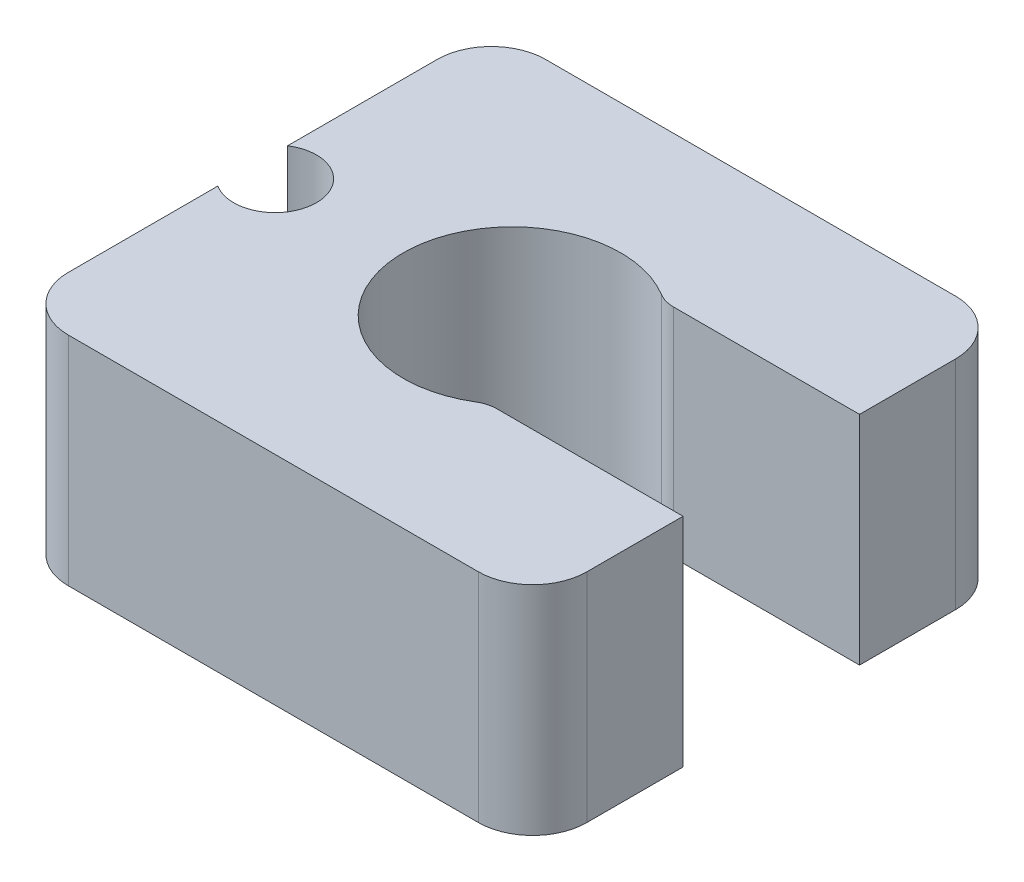
ISO-10303-21;
HEADER;
FILE_DESCRIPTION(('STEP AP214'),'2;1');
FILE_NAME('part.step','',(''),(''),'','','');
FILE_SCHEMA(('AUTOMOTIVE_DESIGN { 1 0 10303 214 1 1 1 1 }'));
ENDSEC;
DATA;
#1=APPLICATION_CONTEXT('core data for automotive mechanical design processes');
#2=APPLICATION_PROTOCOL_DEFINITION('international standard','automotive_design',2000,#1);
#3=PRODUCT_CONTEXT('',#1,'mechanical');
#4=PRODUCT('Part','Part','',(#3));
#5=PRODUCT_RELATED_PRODUCT_CATEGORY('part','',(#4));
#6=PRODUCT_DEFINITION_FORMATION('','',#4);
#7=PRODUCT_DEFINITION_CONTEXT('part definition',#1,'design');
#8=PRODUCT_DEFINITION('design','',#6,#7);
#9=PRODUCT_DEFINITION_SHAPE('','',#8);
#10=(LENGTH_UNIT() NAMED_UNIT(*) SI_UNIT(.MILLI.,.METRE.));
#11=(NAMED_UNIT(*) PLANE_ANGLE_UNIT() SI_UNIT($,.RADIAN.));
#12=(NAMED_UNIT(*) SI_UNIT($,.STERADIAN.) SOLID_ANGLE_UNIT());
#13=UNCERTAINTY_MEASURE_WITH_UNIT(LENGTH_MEASURE(1.E-05),#10,'distance_accuracy_value','');
#14=(GEOMETRIC_REPRESENTATION_CONTEXT(3) GLOBAL_UNCERTAINTY_ASSIGNED_CONTEXT((#13)) GLOBAL_UNIT_ASSIGNED_CONTEXT((#10,
#11,#12)) REPRESENTATION_CONTEXT('',''));
#15=CARTESIAN_POINT('',(0.,0.,0.));
#16=DIRECTION('',(0.,0.,1.));
#17=DIRECTION('',(1.,0.,0.));
#18=AXIS2_PLACEMENT_3D('',#15,#16,#17);
#19=CARTESIAN_POINT('',(2.38772044704865,2.,0.));
#20=DIRECTION('',(1.,0.,0.));
#21=DIRECTION('',(0.,0.,-1.));
#22=AXIS2_PLACEMENT_3D('',#19,#20,#21);
#23=PLANE('',#22);
#24=DIRECTION('',(0.,1.,0.));
#25=VECTOR('',#24,1.);
#26=CARTESIAN_POINT('',(2.38772044704865,0.,-0.81271182190646));
#27=LINE('',#26,#25);
#28=CARTESIAN_POINT('',(2.38772044704865,0.,-0.81271182190646));
#29=VERTEX_POINT('',#28);
#30=CARTESIAN_POINT('',(2.38772044704865,2.,-0.81271182190646));
#31=VERTEX_POINT('',#30);
#32=EDGE_CURVE('E165',#29,#31,#27,.T.);
#33=ORIENTED_EDGE('',*,*,#32,.F.);
#34=DIRECTION('',(0.,0.,1.));
#35=VECTOR('',#34,1.);
#36=CARTESIAN_POINT('',(2.38772044704865,0.,0.));
#37=LINE('',#36,#35);
#38=CARTESIAN_POINT('',(2.38772044704865,0.,-1.69775483675836));
#39=VERTEX_POINT('',#38);
#40=EDGE_CURVE('E178',#39,#29,#37,.T.);
#41=ORIENTED_EDGE('',*,*,#40,.F.);
#42=DIRECTION('',(0.,-1.,0.));
#43=VECTOR('',#42,1.);
#44=CARTESIAN_POINT('',(2.38772044704865,2.,-1.69775483675836));
#45=LINE('',#44,#43);
#46=CARTESIAN_POINT('',(2.38772044704865,2.,-1.69775483675836));
#47=VERTEX_POINT('',#46);
#48=EDGE_CURVE('E219',#39,#47,#45,.F.);
#49=ORIENTED_EDGE('',*,*,#48,.T.);
#50=DIRECTION('',(0.,0.,1.));
#51=VECTOR('',#50,1.);
#52=CARTESIAN_POINT('',(2.38772044704865,2.,0.));
#53=LINE('',#52,#51);
#54=EDGE_CURVE('E181',#47,#31,#53,.T.);
#55=ORIENTED_EDGE('',*,*,#54,.T.);
#56=EDGE_LOOP('',(#33,#41,#49,#55));
#57=FACE_BOUND('',#56,.T.);
#58=ADVANCED_FACE('F47',(#57),#23,.T.);
#59=DIRECTION('',(0.,1.,0.));
#60=VECTOR('',#59,1.);
#61=CARTESIAN_POINT('',(2.38772044704865,0.,0.812711821906446));
#62=LINE('',#61,#60);
#63=CARTESIAN_POINT('',(2.38772044704865,0.,0.812711821906446));
#64=VERTEX_POINT('',#63);
#65=CARTESIAN_POINT('',(2.38772044704865,2.,0.812711821906446));
#66=VERTEX_POINT('',#65);
#67=EDGE_CURVE('E172',#64,#66,#62,.T.);
#68=ORIENTED_EDGE('',*,*,#67,.T.);
#69=CARTESIAN_POINT('',(2.38772044704865,2.,1.69775483675836));
#70=VERTEX_POINT('',#69);
#71=EDGE_CURVE('E320',#66,#70,#53,.T.);
#72=ORIENTED_EDGE('',*,*,#71,.T.);
#73=DIRECTION('',(0.,-1.,0.));
#74=VECTOR('',#73,1.);
#75=CARTESIAN_POINT('',(2.38772044704865,0.,1.69775483675836));
#76=LINE('',#75,#74);
#77=CARTESIAN_POINT('',(2.38772044704865,0.,1.69775483675836));
#78=VERTEX_POINT('',#77);
#79=EDGE_CURVE('E262',#70,#78,#76,.T.);
#80=ORIENTED_EDGE('',*,*,#79,.T.);
#81=EDGE_CURVE('E190',#64,#78,#37,.T.);
#82=ORIENTED_EDGE('',*,*,#81,.F.);
#83=EDGE_LOOP('',(#68,#72,#80,#82));
#84=FACE_BOUND('',#83,.T.);
#85=ADVANCED_FACE('F365',(#84),#23,.T.);
#86=CARTESIAN_POINT('',(0.,2.,0.));
#87=DIRECTION('',(0.,-1.,0.));
#88=DIRECTION('',(0.,0.,-1.));
#89=AXIS2_PLACEMENT_3D('',#86,#87,#88);
#90=CYLINDRICAL_SURFACE('',#89,1.00190226245612);
#91=CARTESIAN_POINT('',(0.,0.,0.));
#92=DIRECTION('',(0.,1.,0.));
#93=DIRECTION('',(0.,0.,1.));
#94=AXIS2_PLACEMENT_3D('',#91,#92,#93);
#95=CIRCLE('',#94,1.00190226245612);
#96=CARTESIAN_POINT('',(0.520140217106621,0.,-0.856307361910992));
#97=VERTEX_POINT('',#96);
#98=CARTESIAN_POINT('',(0.520140217106639,0.,0.856307361910981));
#99=VERTEX_POINT('',#98);
#100=EDGE_CURVE('E200',#97,#99,#95,.T.);
#101=ORIENTED_EDGE('',*,*,#100,.F.);
#102=DIRECTION('',(0.,-1.,0.));
#103=VECTOR('',#102,1.);
#104=CARTESIAN_POINT('',(0.520140217106621,2.,-0.856307361910992));
#105=LINE('',#104,#103);
#106=CARTESIAN_POINT('',(0.520140217106621,2.,-0.856307361910992));
#107=VERTEX_POINT('',#106);
#108=EDGE_CURVE('E277',#97,#107,#105,.F.);
#109=ORIENTED_EDGE('',*,*,#108,.T.);
#110=CARTESIAN_POINT('',(0.,2.,0.));
#111=DIRECTION('',(0.,1.,0.));
#112=DIRECTION('',(0.,0.,1.));
#113=AXIS2_PLACEMENT_3D('',#110,#111,#112);
#114=CIRCLE('',#113,1.00190226245612);
#115=CARTESIAN_POINT('',(0.520140217106639,2.,0.856307361910981));
#116=VERTEX_POINT('',#115);
#117=EDGE_CURVE('E210',#107,#116,#114,.T.);
#118=ORIENTED_EDGE('',*,*,#117,.T.);
#119=DIRECTION('',(0.,-1.,0.));
#120=VECTOR('',#119,1.);
#121=CARTESIAN_POINT('',(0.520140217106639,2.,0.856307361910982));
#122=LINE('',#121,#120);
#123=EDGE_CURVE('E274',#116,#99,#122,.T.);
#124=ORIENTED_EDGE('',*,*,#123,.T.);
#125=EDGE_LOOP('',(#101,#109,#118,#124));
#126=FACE_BOUND('',#125,.T.);
#127=ADVANCED_FACE('F294',(#126),#90,.F.);
#128=CARTESIAN_POINT('',(0.,2.,0.));
#129=DIRECTION('',(0.,1.,0.));
#130=DIRECTION('',(0.,0.,1.));
#131=AXIS2_PLACEMENT_3D('',#128,#129,#130);
#132=PLANE('',#131);
#133=ORIENTED_EDGE('',*,*,#117,.F.);
#134=CARTESIAN_POINT('',(0.67588601285865,2.,-1.11271182190646));
#135=DIRECTION('',(0.,1.,0.));
#136=DIRECTION('',(0.,0.,1.));
#137=AXIS2_PLACEMENT_3D('',#134,#135,#136);
#138=CIRCLE('',#137,0.3);
#139=CARTESIAN_POINT('',(0.67588601285865,2.,-0.81271182190646));
#140=VERTEX_POINT('',#139);
#141=EDGE_CURVE('E56',#107,#140,#138,.T.);
#142=ORIENTED_EDGE('',*,*,#141,.T.);
#143=DIRECTION('',(-1.,0.,0.));
#144=VECTOR('',#143,1.);
#145=CARTESIAN_POINT('',(0.,2.,-0.81271182190646));
#146=LINE('',#145,#144);
#147=EDGE_CURVE('E284',#31,#140,#146,.T.);
#148=ORIENTED_EDGE('',*,*,#147,.F.);
#149=ORIENTED_EDGE('',*,*,#54,.F.);
#150=CARTESIAN_POINT('',(1.88772044704865,2.,-1.69775483675836));
#151=DIRECTION('',(0.,1.,0.));
#152=DIRECTION('',(0.,0.,1.));
#153=AXIS2_PLACEMENT_3D('',#150,#151,#152);
#154=CIRCLE('',#153,0.5);
#155=CARTESIAN_POINT('',(1.88772044704865,2.,-2.19775483675836));
#156=VERTEX_POINT('',#155);
#157=EDGE_CURVE('E222',#47,#156,#154,.T.);
#158=ORIENTED_EDGE('',*,*,#157,.T.);
#159=DIRECTION('',(1.,0.,0.));
#160=VECTOR('',#159,1.);
#161=CARTESIAN_POINT('',(0.,2.,-2.19775483675836));
#162=LINE('',#161,#160);
#163=CARTESIAN_POINT('',(-1.88772044704865,2.,-2.19775483675836));
#164=VERTEX_POINT('',#163);
#165=EDGE_CURVE('E323',#164,#156,#162,.T.);
#166=ORIENTED_EDGE('',*,*,#165,.F.);
#167=CARTESIAN_POINT('',(-1.88772044704865,2.,-1.69775483675836));
#168=DIRECTION('',(0.,1.,0.));
#169=DIRECTION('',(0.,0.,1.));
#170=AXIS2_PLACEMENT_3D('',#167,#168,#169);
#171=CIRCLE('',#170,0.5);
#172=CARTESIAN_POINT('',(-2.38772044704865,2.,-1.69775483675836));
#173=VERTEX_POINT('',#172);
#174=EDGE_CURVE('E249',#164,#173,#171,.T.);
#175=ORIENTED_EDGE('',*,*,#174,.T.);
#176=DIRECTION('',(0.,0.,1.));
#177=VECTOR('',#176,1.);
#178=CARTESIAN_POINT('',(-2.38772044704865,2.,0.));
#179=LINE('',#178,#177);
#180=CARTESIAN_POINT('',(-2.38772044704865,2.,-0.32125797516647));
#181=VERTEX_POINT('',#180);
#182=EDGE_CURVE('E316',#173,#181,#179,.T.);
#183=ORIENTED_EDGE('',*,*,#182,.T.);
#184=CARTESIAN_POINT('',(-2.18194647457192,2.,0.));
#185=DIRECTION('',(0.,1.,0.));
#186=DIRECTION('',(0.,0.,1.));
#187=AXIS2_PLACEMENT_3D('',#184,#185,#186);
#188=CIRCLE('',#187,0.381509651721835);
#189=CARTESIAN_POINT('',(-2.38772044704865,2.,0.32125797516647));
#190=VERTEX_POINT('',#189);
#191=EDGE_CURVE('E204',#190,#181,#188,.T.);
#192=ORIENTED_EDGE('',*,*,#191,.F.);
#193=CARTESIAN_POINT('',(-2.38772044704865,2.,1.69775483675836));
#194=VERTEX_POINT('',#193);
#195=EDGE_CURVE('E311',#190,#194,#179,.T.);
#196=ORIENTED_EDGE('',*,*,#195,.T.);
#197=CARTESIAN_POINT('',(-1.88772044704865,2.,1.69775483675836));
#198=DIRECTION('',(0.,1.,0.));
#199=DIRECTION('',(0.,0.,1.));
#200=AXIS2_PLACEMENT_3D('',#197,#198,#199);
#201=CIRCLE('',#200,0.5);
#202=CARTESIAN_POINT('',(-1.88772044704865,2.,2.19775483675836));
#203=VERTEX_POINT('',#202);
#204=EDGE_CURVE('E246',#194,#203,#201,.T.);
#205=ORIENTED_EDGE('',*,*,#204,.T.);
#206=DIRECTION('',(1.,0.,0.));
#207=VECTOR('',#206,1.);
#208=CARTESIAN_POINT('',(0.,2.,2.19775483675836));
#209=LINE('',#208,#207);
#210=CARTESIAN_POINT('',(1.88772044704865,2.,2.19775483675836));
#211=VERTEX_POINT('',#210);
#212=EDGE_CURVE('E315',#203,#211,#209,.T.);
#213=ORIENTED_EDGE('',*,*,#212,.T.);
#214=CARTESIAN_POINT('',(1.88772044704865,2.,1.69775483675836));
#215=DIRECTION('',(0.,1.,0.));
#216=DIRECTION('',(0.,0.,1.));
#217=AXIS2_PLACEMENT_3D('',#214,#215,#216);
#218=CIRCLE('',#217,0.5);
#219=EDGE_CURVE('E242',#211,#70,#218,.T.);
#220=ORIENTED_EDGE('',*,*,#219,.T.);
#221=ORIENTED_EDGE('',*,*,#71,.F.);
#222=DIRECTION('',(1.,0.,0.));
#223=VECTOR('',#222,1.);
#224=CARTESIAN_POINT('',(0.,2.,0.812711821906446));
#225=LINE('',#224,#223);
#226=CARTESIAN_POINT('',(0.675886012858673,2.,0.812711821906446));
#227=VERTEX_POINT('',#226);
#228=EDGE_CURVE('E288',#227,#66,#225,.T.);
#229=ORIENTED_EDGE('',*,*,#228,.F.);
#230=CARTESIAN_POINT('',(0.675886012858673,2.,1.11271182190645));
#231=DIRECTION('',(0.,1.,0.));
#232=DIRECTION('',(0.,0.,1.));
#233=AXIS2_PLACEMENT_3D('',#230,#231,#232);
#234=CIRCLE('',#233,0.3);
#235=EDGE_CURVE('E63',#227,#116,#234,.T.);
#236=ORIENTED_EDGE('',*,*,#235,.T.);
#237=EDGE_LOOP('',(#133,#142,#148,#149,#158,#166,#175,#183,#192,#196,#205,#213,#220,#221,#229,#236));
#238=FACE_BOUND('',#237,.T.);
#239=ADVANCED_FACE('F283',(#238),#132,.T.);
#240=CARTESIAN_POINT('',(0.,0.,0.));
#241=DIRECTION('',(0.,1.,0.));
#242=DIRECTION('',(0.,0.,1.));
#243=AXIS2_PLACEMENT_3D('',#240,#241,#242);
#244=PLANE('',#243);
#245=DIRECTION('',(-1.,0.,0.));
#246=VECTOR('',#245,1.);
#247=CARTESIAN_POINT('',(0.,0.,-0.81271182190646));
#248=LINE('',#247,#246);
#249=CARTESIAN_POINT('',(0.67588601285865,0.,-0.81271182190646));
#250=VERTEX_POINT('',#249);
#251=EDGE_CURVE('E161',#29,#250,#248,.T.);
#252=ORIENTED_EDGE('',*,*,#251,.T.);
#253=CARTESIAN_POINT('',(0.67588601285865,0.,-1.11271182190646));
#254=DIRECTION('',(0.,1.,0.));
#255=DIRECTION('',(0.,0.,1.));
#256=AXIS2_PLACEMENT_3D('',#253,#254,#255);
#257=CIRCLE('',#256,0.3);
#258=EDGE_CURVE('E271',#250,#97,#257,.F.);
#259=ORIENTED_EDGE('',*,*,#258,.T.);
#260=ORIENTED_EDGE('',*,*,#100,.T.);
#261=CARTESIAN_POINT('',(0.675886012858673,0.,1.11271182190645));
#262=DIRECTION('',(0.,1.,0.));
#263=DIRECTION('',(0.,0.,1.));
#264=AXIS2_PLACEMENT_3D('',#261,#262,#263);
#265=CIRCLE('',#264,0.3);
#266=CARTESIAN_POINT('',(0.675886012858673,0.,0.812711821906446));
#267=VERTEX_POINT('',#266);
#268=EDGE_CURVE('E268',#99,#267,#265,.F.);
#269=ORIENTED_EDGE('',*,*,#268,.T.);
#270=DIRECTION('',(1.,0.,0.));
#271=VECTOR('',#270,1.);
#272=CARTESIAN_POINT('',(0.,0.,0.812711821906446));
#273=LINE('',#272,#271);
#274=EDGE_CURVE('E173',#267,#64,#273,.T.);
#275=ORIENTED_EDGE('',*,*,#274,.T.);
#276=ORIENTED_EDGE('',*,*,#81,.T.);
#277=CARTESIAN_POINT('',(1.88772044704865,0.,1.69775483675836));
#278=DIRECTION('',(0.,1.,0.));
#279=DIRECTION('',(0.,0.,1.));
#280=AXIS2_PLACEMENT_3D('',#277,#278,#279);
#281=CIRCLE('',#280,0.5);
#282=CARTESIAN_POINT('',(1.88772044704865,0.,2.19775483675836));
#283=VERTEX_POINT('',#282);
#284=EDGE_CURVE('E230',#78,#283,#281,.F.);
#285=ORIENTED_EDGE('',*,*,#284,.T.);
#286=DIRECTION('',(1.,0.,0.));
#287=VECTOR('',#286,1.);
#288=CARTESIAN_POINT('',(0.,0.,2.19775483675836));
#289=LINE('',#288,#287);
#290=CARTESIAN_POINT('',(-1.88772044704865,0.,2.19775483675836));
#291=VERTEX_POINT('',#290);
#292=EDGE_CURVE('E196',#291,#283,#289,.T.);
#293=ORIENTED_EDGE('',*,*,#292,.F.);
#294=CARTESIAN_POINT('',(-1.88772044704865,0.,1.69775483675836));
#295=DIRECTION('',(0.,1.,0.));
#296=DIRECTION('',(0.,0.,1.));
#297=AXIS2_PLACEMENT_3D('',#294,#295,#296);
#298=CIRCLE('',#297,0.5);
#299=CARTESIAN_POINT('',(-2.38772044704865,0.,1.69775483675836));
#300=VERTEX_POINT('',#299);
#301=EDGE_CURVE('E233',#291,#300,#298,.F.);
#302=ORIENTED_EDGE('',*,*,#301,.T.);
#303=DIRECTION('',(0.,0.,1.));
#304=VECTOR('',#303,1.);
#305=CARTESIAN_POINT('',(-2.38772044704865,0.,0.));
#306=LINE('',#305,#304);
#307=CARTESIAN_POINT('',(-2.38772044704865,0.,0.32125797516647));
#308=VERTEX_POINT('',#307);
#309=EDGE_CURVE('E330',#308,#300,#306,.T.);
#310=ORIENTED_EDGE('',*,*,#309,.F.);
#311=CARTESIAN_POINT('',(-2.18194647457192,0.,0.));
#312=DIRECTION('',(0.,1.,0.));
#313=DIRECTION('',(0.,0.,1.));
#314=AXIS2_PLACEMENT_3D('',#311,#312,#313);
#315=CIRCLE('',#314,0.381509651721835);
#316=CARTESIAN_POINT('',(-2.38772044704865,0.,-0.32125797516647));
#317=VERTEX_POINT('',#316);
#318=EDGE_CURVE('E183',#308,#317,#315,.T.);
#319=ORIENTED_EDGE('',*,*,#318,.T.);
#320=CARTESIAN_POINT('',(-2.38772044704865,0.,-1.69775483675836));
#321=VERTEX_POINT('',#320);
#322=EDGE_CURVE('E194',#321,#317,#306,.T.);
#323=ORIENTED_EDGE('',*,*,#322,.F.);
#324=CARTESIAN_POINT('',(-1.88772044704865,0.,-1.69775483675836));
#325=DIRECTION('',(0.,1.,0.));
#326=DIRECTION('',(0.,0.,1.));
#327=AXIS2_PLACEMENT_3D('',#324,#325,#326);
#328=CIRCLE('',#327,0.5);
#329=CARTESIAN_POINT('',(-1.88772044704865,0.,-2.19775483675836));
#330=VERTEX_POINT('',#329);
#331=EDGE_CURVE('E236',#321,#330,#328,.F.);
#332=ORIENTED_EDGE('',*,*,#331,.T.);
#333=DIRECTION('',(1.,0.,0.));
#334=VECTOR('',#333,1.);
#335=CARTESIAN_POINT('',(0.,0.,-2.19775483675836));
#336=LINE('',#335,#334);
#337=CARTESIAN_POINT('',(1.88772044704865,0.,-2.19775483675836));
#338=VERTEX_POINT('',#337);
#339=EDGE_CURVE('E189',#330,#338,#336,.T.);
#340=ORIENTED_EDGE('',*,*,#339,.T.);
#341=CARTESIAN_POINT('',(1.88772044704865,0.,-1.69775483675836));
#342=DIRECTION('',(0.,1.,0.));
#343=DIRECTION('',(0.,0.,1.));
#344=AXIS2_PLACEMENT_3D('',#341,#342,#343);
#345=CIRCLE('',#344,0.5);
#346=EDGE_CURVE('E187',#338,#39,#345,.F.);
#347=ORIENTED_EDGE('',*,*,#346,.T.);
#348=ORIENTED_EDGE('',*,*,#40,.T.);
#349=EDGE_LOOP('',(#252,#259,#260,#269,#275,#276,#285,#293,#302,#310,#319,#323,#332,#340,#347,#348));
#350=FACE_BOUND('',#349,.T.);
#351=ADVANCED_FACE('F185',(#350),#244,.F.);
#352=CARTESIAN_POINT('',(-2.18194647457192,2.,0.));
#353=DIRECTION('',(0.,-1.,0.));
#354=DIRECTION('',(0.,0.,-1.));
#355=AXIS2_PLACEMENT_3D('',#352,#353,#354);
#356=CYLINDRICAL_SURFACE('',#355,0.381509651721835);
#357=ORIENTED_EDGE('',*,*,#318,.F.);
#358=DIRECTION('',(0.,-1.,0.));
#359=VECTOR('',#358,1.);
#360=CARTESIAN_POINT('',(-2.38772044704865,2.,0.32125797516647));
#361=LINE('',#360,#359);
#362=EDGE_CURVE('E209',#190,#308,#361,.T.);
#363=ORIENTED_EDGE('',*,*,#362,.F.);
#364=ORIENTED_EDGE('',*,*,#191,.T.);
#365=DIRECTION('',(0.,-1.,0.));
#366=VECTOR('',#365,1.);
#367=CARTESIAN_POINT('',(-2.38772044704865,2.,-0.32125797516647));
#368=LINE('',#367,#366);
#369=EDGE_CURVE('E205',#181,#317,#368,.T.);
#370=ORIENTED_EDGE('',*,*,#369,.T.);
#371=EDGE_LOOP('',(#357,#363,#364,#370));
#372=FACE_BOUND('',#371,.T.);
#373=ADVANCED_FACE('F347',(#372),#356,.F.);
#374=CARTESIAN_POINT('',(-2.38772044704865,2.,0.));
#375=DIRECTION('',(1.,0.,0.));
#376=DIRECTION('',(0.,0.,-1.));
#377=AXIS2_PLACEMENT_3D('',#374,#375,#376);
#378=PLANE('',#377);
#379=ORIENTED_EDGE('',*,*,#309,.T.);
#380=DIRECTION('',(0.,-1.,0.));
#381=VECTOR('',#380,1.);
#382=CARTESIAN_POINT('',(-2.38772044704865,2.,1.69775483675836));
#383=LINE('',#382,#381);
#384=EDGE_CURVE('E259',#300,#194,#383,.F.);
#385=ORIENTED_EDGE('',*,*,#384,.T.);
#386=ORIENTED_EDGE('',*,*,#195,.F.);
#387=ORIENTED_EDGE('',*,*,#362,.T.);
#388=EDGE_LOOP('',(#379,#385,#386,#387));
#389=FACE_BOUND('',#388,.T.);
#390=ADVANCED_FACE('F388',(#389),#378,.F.);
#391=CARTESIAN_POINT('',(0.,2.,2.19775483675836));
#392=DIRECTION('',(0.,0.,-1.));
#393=DIRECTION('',(-1.,0.,0.));
#394=AXIS2_PLACEMENT_3D('',#391,#392,#393);
#395=PLANE('',#394);
#396=ORIENTED_EDGE('',*,*,#212,.F.);
#397=DIRECTION('',(0.,-1.,0.));
#398=VECTOR('',#397,1.);
#399=CARTESIAN_POINT('',(-1.88772044704865,2.,2.19775483675836));
#400=LINE('',#399,#398);
#401=EDGE_CURVE('E255',#203,#291,#400,.T.);
#402=ORIENTED_EDGE('',*,*,#401,.T.);
#403=ORIENTED_EDGE('',*,*,#292,.T.);
#404=DIRECTION('',(0.,-1.,0.));
#405=VECTOR('',#404,1.);
#406=CARTESIAN_POINT('',(1.88772044704865,2.,2.19775483675836));
#407=LINE('',#406,#405);
#408=EDGE_CURVE('E252',#283,#211,#407,.F.);
#409=ORIENTED_EDGE('',*,*,#408,.T.);
#410=EDGE_LOOP('',(#396,#402,#403,#409));
#411=FACE_BOUND('',#410,.T.);
#412=ADVANCED_FACE('F356',(#411),#395,.F.);
#413=CARTESIAN_POINT('',(0.,2.,-2.19775483675836));
#414=DIRECTION('',(0.,0.,-1.));
#415=DIRECTION('',(-1.,0.,0.));
#416=AXIS2_PLACEMENT_3D('',#413,#414,#415);
#417=PLANE('',#416);
#418=ORIENTED_EDGE('',*,*,#339,.F.);
#419=DIRECTION('',(0.,-1.,0.));
#420=VECTOR('',#419,1.);
#421=CARTESIAN_POINT('',(-1.88772044704865,2.,-2.19775483675836));
#422=LINE('',#421,#420);
#423=EDGE_CURVE('E239',#330,#164,#422,.F.);
#424=ORIENTED_EDGE('',*,*,#423,.T.);
#425=ORIENTED_EDGE('',*,*,#165,.T.);
#426=DIRECTION('',(0.,-1.,0.));
#427=VECTOR('',#426,1.);
#428=CARTESIAN_POINT('',(1.88772044704865,2.,-2.19775483675836));
#429=LINE('',#428,#427);
#430=EDGE_CURVE('E213',#156,#338,#429,.T.);
#431=ORIENTED_EDGE('',*,*,#430,.T.);
#432=EDGE_LOOP('',(#418,#424,#425,#431));
#433=FACE_BOUND('',#432,.T.);
#434=ADVANCED_FACE('F375',(#433),#417,.T.);
#435=ORIENTED_EDGE('',*,*,#182,.F.);
#436=DIRECTION('',(0.,-1.,0.));
#437=VECTOR('',#436,1.);
#438=CARTESIAN_POINT('',(-2.38772044704865,0.,-1.69775483675836));
#439=LINE('',#438,#437);
#440=EDGE_CURVE('E226',#173,#321,#439,.T.);
#441=ORIENTED_EDGE('',*,*,#440,.T.);
#442=ORIENTED_EDGE('',*,*,#322,.T.);
#443=ORIENTED_EDGE('',*,*,#369,.F.);
#444=EDGE_LOOP('',(#435,#441,#442,#443));
#445=FACE_BOUND('',#444,.T.);
#446=ADVANCED_FACE('F343',(#445),#378,.F.);
#447=CARTESIAN_POINT('',(1.88772044704865,2.,-1.69775483675836));
#448=DIRECTION('',(0.,-1.,0.));
#449=DIRECTION('',(0.,0.,-1.));
#450=AXIS2_PLACEMENT_3D('',#447,#448,#449);
#451=CYLINDRICAL_SURFACE('',#450,0.5);
#452=ORIENTED_EDGE('',*,*,#157,.F.);
#453=ORIENTED_EDGE('',*,*,#48,.F.);
#454=ORIENTED_EDGE('',*,*,#346,.F.);
#455=ORIENTED_EDGE('',*,*,#430,.F.);
#456=EDGE_LOOP('',(#452,#453,#454,#455));
#457=FACE_BOUND('',#456,.T.);
#458=ADVANCED_FACE('F379',(#457),#451,.T.);
#459=CARTESIAN_POINT('',(-1.88772044704865,2.,-1.69775483675836));
#460=DIRECTION('',(0.,1.,0.));
#461=DIRECTION('',(0.,0.,1.));
#462=AXIS2_PLACEMENT_3D('',#459,#460,#461);
#463=CYLINDRICAL_SURFACE('',#462,0.5);
#464=ORIENTED_EDGE('',*,*,#174,.F.);
#465=ORIENTED_EDGE('',*,*,#423,.F.);
#466=ORIENTED_EDGE('',*,*,#331,.F.);
#467=ORIENTED_EDGE('',*,*,#440,.F.);
#468=EDGE_LOOP('',(#464,#465,#466,#467));
#469=FACE_BOUND('',#468,.T.);
#470=ADVANCED_FACE('F371',(#469),#463,.T.);
#471=CARTESIAN_POINT('',(-1.88772044704865,2.,1.69775483675836));
#472=DIRECTION('',(0.,-1.,0.));
#473=DIRECTION('',(0.,0.,-1.));
#474=AXIS2_PLACEMENT_3D('',#471,#472,#473);
#475=CYLINDRICAL_SURFACE('',#474,0.5);
#476=ORIENTED_EDGE('',*,*,#204,.F.);
#477=ORIENTED_EDGE('',*,*,#384,.F.);
#478=ORIENTED_EDGE('',*,*,#301,.F.);
#479=ORIENTED_EDGE('',*,*,#401,.F.);
#480=EDGE_LOOP('',(#476,#477,#478,#479));
#481=FACE_BOUND('',#480,.T.);
#482=ADVANCED_FACE('F353',(#481),#475,.T.);
#483=CARTESIAN_POINT('',(1.88772044704865,2.,1.69775483675836));
#484=DIRECTION('',(0.,1.,0.));
#485=DIRECTION('',(0.,0.,1.));
#486=AXIS2_PLACEMENT_3D('',#483,#484,#485);
#487=CYLINDRICAL_SURFACE('',#486,0.5);
#488=ORIENTED_EDGE('',*,*,#219,.F.);
#489=ORIENTED_EDGE('',*,*,#408,.F.);
#490=ORIENTED_EDGE('',*,*,#284,.F.);
#491=ORIENTED_EDGE('',*,*,#79,.F.);
#492=EDGE_LOOP('',(#488,#489,#490,#491));
#493=FACE_BOUND('',#492,.T.);
#494=ADVANCED_FACE('F362',(#493),#487,.T.);
#495=CARTESIAN_POINT('',(0.,0.,0.812711821906446));
#496=DIRECTION('',(0.,0.,1.));
#497=DIRECTION('',(1.,0.,0.));
#498=AXIS2_PLACEMENT_3D('',#495,#496,#497);
#499=PLANE('',#498);
#500=ORIENTED_EDGE('',*,*,#274,.F.);
#501=DIRECTION('',(0.,1.,0.));
#502=VECTOR('',#501,1.);
#503=CARTESIAN_POINT('',(0.675886012858673,2.,0.812711821906446));
#504=LINE('',#503,#502);
#505=EDGE_CURVE('E11',#267,#227,#504,.T.);
#506=ORIENTED_EDGE('',*,*,#505,.T.);
#507=ORIENTED_EDGE('',*,*,#228,.T.);
#508=ORIENTED_EDGE('',*,*,#67,.F.);
#509=EDGE_LOOP('',(#500,#506,#507,#508));
#510=FACE_BOUND('',#509,.T.);
#511=ADVANCED_FACE('F298',(#510),#499,.F.);
#512=CARTESIAN_POINT('',(0.,0.,-0.81271182190646));
#513=DIRECTION('',(0.,0.,-1.));
#514=DIRECTION('',(-1.,0.,0.));
#515=AXIS2_PLACEMENT_3D('',#512,#513,#514);
#516=PLANE('',#515);
#517=ORIENTED_EDGE('',*,*,#147,.T.);
#518=DIRECTION('',(0.,1.,0.));
#519=VECTOR('',#518,1.);
#520=CARTESIAN_POINT('',(0.67588601285865,0.,-0.81271182190646));
#521=LINE('',#520,#519);
#522=EDGE_CURVE('E168',#140,#250,#521,.F.);
#523=ORIENTED_EDGE('',*,*,#522,.T.);
#524=ORIENTED_EDGE('',*,*,#251,.F.);
#525=ORIENTED_EDGE('',*,*,#32,.T.);
#526=EDGE_LOOP('',(#517,#523,#524,#525));
#527=FACE_BOUND('',#526,.T.);
#528=ADVANCED_FACE('F164',(#527),#516,.F.);
#529=CARTESIAN_POINT('',(0.67588601285865,2.,-1.11271182190646));
#530=DIRECTION('',(0.,-1.,0.));
#531=DIRECTION('',(0.,0.,-1.));
#532=AXIS2_PLACEMENT_3D('',#529,#530,#531);
#533=CYLINDRICAL_SURFACE('',#532,0.3);
#534=ORIENTED_EDGE('',*,*,#141,.F.);
#535=ORIENTED_EDGE('',*,*,#108,.F.);
#536=ORIENTED_EDGE('',*,*,#258,.F.);
#537=ORIENTED_EDGE('',*,*,#522,.F.);
#538=EDGE_LOOP('',(#534,#535,#536,#537));
#539=FACE_BOUND('',#538,.T.);
#540=ADVANCED_FACE('F290',(#539),#533,.T.);
#541=CARTESIAN_POINT('',(0.675886012858673,2.,1.11271182190645));
#542=DIRECTION('',(0.,-1.,0.));
#543=DIRECTION('',(0.,0.,-1.));
#544=AXIS2_PLACEMENT_3D('',#541,#542,#543);
#545=CYLINDRICAL_SURFACE('',#544,0.3);
#546=ORIENTED_EDGE('',*,*,#268,.F.);
#547=ORIENTED_EDGE('',*,*,#123,.F.);
#548=ORIENTED_EDGE('',*,*,#235,.F.);
#549=ORIENTED_EDGE('',*,*,#505,.F.);
#550=EDGE_LOOP('',(#546,#547,#548,#549));
#551=FACE_BOUND('',#550,.T.);
#552=ADVANCED_FACE('F49',(#551),#545,.T.);
#553=CLOSED_SHELL('',(#58,#85,#127,#239,#351,#373,#390,#412,#434,#446,#458,#470,#482,#494,#511,
#528,#540,#552));
#554=MANIFOLD_SOLID_BREP('B2',#553);
#555=ADVANCED_BREP_SHAPE_REPRESENTATION('',(#18,#554),#14);
#556=SHAPE_DEFINITION_REPRESENTATION(#9,#555);
ENDSEC;
END-ISO-10303-21;
